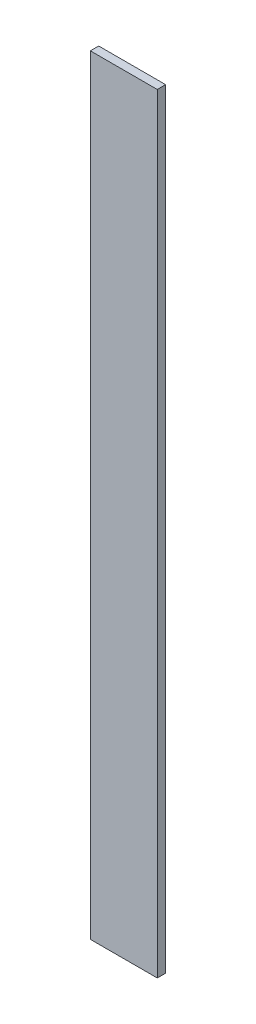
ISO-10303-21;
HEADER;
FILE_DESCRIPTION(('STEP AP214'),'2;1');
FILE_NAME('part.step','',(''),(''),'','','');
FILE_SCHEMA(('AUTOMOTIVE_DESIGN { 1 0 10303 214 1 1 1 1 }'));
ENDSEC;
DATA;
#1=APPLICATION_CONTEXT('core data for automotive mechanical design processes');
#2=APPLICATION_PROTOCOL_DEFINITION('international standard','automotive_design',2000,#1);
#3=PRODUCT_CONTEXT('',#1,'mechanical');
#4=PRODUCT('Part','Part','',(#3));
#5=PRODUCT_RELATED_PRODUCT_CATEGORY('part','',(#4));
#6=PRODUCT_DEFINITION_FORMATION('','',#4);
#7=PRODUCT_DEFINITION_CONTEXT('part definition',#1,'design');
#8=PRODUCT_DEFINITION('design','',#6,#7);
#9=PRODUCT_DEFINITION_SHAPE('','',#8);
#10=(LENGTH_UNIT() NAMED_UNIT(*) SI_UNIT(.MILLI.,.METRE.));
#11=(NAMED_UNIT(*) PLANE_ANGLE_UNIT() SI_UNIT($,.RADIAN.));
#12=(NAMED_UNIT(*) SI_UNIT($,.STERADIAN.) SOLID_ANGLE_UNIT());
#13=UNCERTAINTY_MEASURE_WITH_UNIT(LENGTH_MEASURE(1.E-05),#10,'distance_accuracy_value','');
#14=(GEOMETRIC_REPRESENTATION_CONTEXT(3) GLOBAL_UNCERTAINTY_ASSIGNED_CONTEXT((#13)) GLOBAL_UNIT_ASSIGNED_CONTEXT((#10,
#11,#12)) REPRESENTATION_CONTEXT('',''));
#15=CARTESIAN_POINT('',(0.,0.,0.));
#16=DIRECTION('',(0.,0.,1.));
#17=DIRECTION('',(1.,0.,0.));
#18=AXIS2_PLACEMENT_3D('',#15,#16,#17);
#19=CARTESIAN_POINT('',(25.4,292.1,6.35));
#20=DIRECTION('',(-1.,0.,0.));
#21=DIRECTION('',(0.,-1.,0.));
#22=AXIS2_PLACEMENT_3D('',#19,#20,#21);
#23=PLANE('',#22);
#24=DIRECTION('',(0.,1.,0.));
#25=VECTOR('',#24,1.);
#26=CARTESIAN_POINT('',(25.4,292.1,0.));
#27=LINE('',#26,#25);
#28=CARTESIAN_POINT('',(25.4,-292.1,0.));
#29=VERTEX_POINT('',#28);
#30=CARTESIAN_POINT('',(25.4,292.1,0.));
#31=VERTEX_POINT('',#30);
#32=EDGE_CURVE('E100',#29,#31,#27,.T.);
#33=ORIENTED_EDGE('',*,*,#32,.T.);
#34=DIRECTION('',(0.,0.,-1.));
#35=VECTOR('',#34,1.);
#36=CARTESIAN_POINT('',(25.4,292.1,6.35));
#37=LINE('',#36,#35);
#38=CARTESIAN_POINT('',(25.4,292.1,6.35));
#39=VERTEX_POINT('',#38);
#40=EDGE_CURVE('E11',#39,#31,#37,.T.);
#41=ORIENTED_EDGE('',*,*,#40,.F.);
#42=DIRECTION('',(0.,1.,0.));
#43=VECTOR('',#42,1.);
#44=CARTESIAN_POINT('',(25.4,292.1,6.35));
#45=LINE('',#44,#43);
#46=CARTESIAN_POINT('',(25.4,-292.1,6.35));
#47=VERTEX_POINT('',#46);
#48=EDGE_CURVE('E88',#47,#39,#45,.T.);
#49=ORIENTED_EDGE('',*,*,#48,.F.);
#50=DIRECTION('',(0.,0.,-1.));
#51=VECTOR('',#50,1.);
#52=CARTESIAN_POINT('',(25.4,-292.1,6.35));
#53=LINE('',#52,#51);
#54=EDGE_CURVE('E96',#47,#29,#53,.T.);
#55=ORIENTED_EDGE('',*,*,#54,.T.);
#56=EDGE_LOOP('',(#33,#41,#49,#55));
#57=FACE_BOUND('',#56,.T.);
#58=ADVANCED_FACE('F37',(#57),#23,.F.);
#59=CARTESIAN_POINT('',(-25.4,292.1,6.35));
#60=DIRECTION('',(0.,-1.,0.));
#61=DIRECTION('',(0.,0.,-1.));
#62=AXIS2_PLACEMENT_3D('',#59,#60,#61);
#63=PLANE('',#62);
#64=DIRECTION('',(-1.,0.,0.));
#65=VECTOR('',#64,1.);
#66=CARTESIAN_POINT('',(-25.4,292.1,0.));
#67=LINE('',#66,#65);
#68=CARTESIAN_POINT('',(-25.4,292.1,0.));
#69=VERTEX_POINT('',#68);
#70=EDGE_CURVE('E92',#31,#69,#67,.T.);
#71=ORIENTED_EDGE('',*,*,#70,.T.);
#72=DIRECTION('',(0.,0.,-1.));
#73=VECTOR('',#72,1.);
#74=CARTESIAN_POINT('',(-25.4,292.1,6.35));
#75=LINE('',#74,#73);
#76=CARTESIAN_POINT('',(-25.4,292.1,6.35));
#77=VERTEX_POINT('',#76);
#78=EDGE_CURVE('E45',#77,#69,#75,.T.);
#79=ORIENTED_EDGE('',*,*,#78,.F.);
#80=DIRECTION('',(-1.,0.,0.));
#81=VECTOR('',#80,1.);
#82=CARTESIAN_POINT('',(-25.4,292.1,6.35));
#83=LINE('',#82,#81);
#84=EDGE_CURVE('E83',#39,#77,#83,.T.);
#85=ORIENTED_EDGE('',*,*,#84,.F.);
#86=ORIENTED_EDGE('',*,*,#40,.T.);
#87=EDGE_LOOP('',(#71,#79,#85,#86));
#88=FACE_BOUND('',#87,.T.);
#89=ADVANCED_FACE('F91',(#88),#63,.F.);
#90=CARTESIAN_POINT('',(-25.4,292.1,6.35));
#91=DIRECTION('',(1.,0.,0.));
#92=DIRECTION('',(0.,1.,0.));
#93=AXIS2_PLACEMENT_3D('',#90,#91,#92);
#94=PLANE('',#93);
#95=DIRECTION('',(0.,-1.,0.));
#96=VECTOR('',#95,1.);
#97=CARTESIAN_POINT('',(-25.4,292.1,0.));
#98=LINE('',#97,#96);
#99=CARTESIAN_POINT('',(-25.4,-292.1,0.));
#100=VERTEX_POINT('',#99);
#101=EDGE_CURVE('E70',#69,#100,#98,.T.);
#102=ORIENTED_EDGE('',*,*,#101,.T.);
#103=DIRECTION('',(0.,0.,-1.));
#104=VECTOR('',#103,1.);
#105=CARTESIAN_POINT('',(-25.4,-292.1,6.35));
#106=LINE('',#105,#104);
#107=CARTESIAN_POINT('',(-25.4,-292.1,6.35));
#108=VERTEX_POINT('',#107);
#109=EDGE_CURVE('E93',#108,#100,#106,.T.);
#110=ORIENTED_EDGE('',*,*,#109,.F.);
#111=DIRECTION('',(0.,-1.,0.));
#112=VECTOR('',#111,1.);
#113=CARTESIAN_POINT('',(-25.4,292.1,6.35));
#114=LINE('',#113,#112);
#115=EDGE_CURVE('E86',#77,#108,#114,.T.);
#116=ORIENTED_EDGE('',*,*,#115,.F.);
#117=ORIENTED_EDGE('',*,*,#78,.T.);
#118=EDGE_LOOP('',(#102,#110,#116,#117));
#119=FACE_BOUND('',#118,.T.);
#120=ADVANCED_FACE('F94',(#119),#94,.F.);
#121=CARTESIAN_POINT('',(-25.4,-292.1,6.35));
#122=DIRECTION('',(0.,1.,0.));
#123=DIRECTION('',(0.,0.,1.));
#124=AXIS2_PLACEMENT_3D('',#121,#122,#123);
#125=PLANE('',#124);
#126=DIRECTION('',(1.,0.,0.));
#127=VECTOR('',#126,1.);
#128=CARTESIAN_POINT('',(-25.4,-292.1,0.));
#129=LINE('',#128,#127);
#130=EDGE_CURVE('E76',#100,#29,#129,.T.);
#131=ORIENTED_EDGE('',*,*,#130,.T.);
#132=ORIENTED_EDGE('',*,*,#54,.F.);
#133=DIRECTION('',(1.,0.,0.));
#134=VECTOR('',#133,1.);
#135=CARTESIAN_POINT('',(-25.4,-292.1,6.35));
#136=LINE('',#135,#134);
#137=EDGE_CURVE('E53',#108,#47,#136,.T.);
#138=ORIENTED_EDGE('',*,*,#137,.F.);
#139=ORIENTED_EDGE('',*,*,#109,.T.);
#140=EDGE_LOOP('',(#131,#132,#138,#139));
#141=FACE_BOUND('',#140,.T.);
#142=ADVANCED_FACE('F107',(#141),#125,.F.);
#143=CARTESIAN_POINT('',(0.,0.,6.35));
#144=DIRECTION('',(0.,0.,1.));
#145=DIRECTION('',(1.,0.,0.));
#146=AXIS2_PLACEMENT_3D('',#143,#144,#145);
#147=PLANE('',#146);
#148=ORIENTED_EDGE('',*,*,#48,.T.);
#149=ORIENTED_EDGE('',*,*,#84,.T.);
#150=ORIENTED_EDGE('',*,*,#115,.T.);
#151=ORIENTED_EDGE('',*,*,#137,.T.);
#152=EDGE_LOOP('',(#148,#149,#150,#151));
#153=FACE_BOUND('',#152,.T.);
#154=ADVANCED_FACE('F84',(#153),#147,.T.);
#155=CARTESIAN_POINT('',(0.,0.,0.));
#156=DIRECTION('',(0.,0.,1.));
#157=DIRECTION('',(1.,0.,0.));
#158=AXIS2_PLACEMENT_3D('',#155,#156,#157);
#159=PLANE('',#158);
#160=ORIENTED_EDGE('',*,*,#32,.F.);
#161=ORIENTED_EDGE('',*,*,#130,.F.);
#162=ORIENTED_EDGE('',*,*,#101,.F.);
#163=ORIENTED_EDGE('',*,*,#70,.F.);
#164=EDGE_LOOP('',(#160,#161,#162,#163));
#165=FACE_BOUND('',#164,.T.);
#166=ADVANCED_FACE('F110',(#165),#159,.F.);
#167=CLOSED_SHELL('',(#58,#89,#120,#142,#154,#166));
#168=MANIFOLD_SOLID_BREP('B2',#167);
#169=ADVANCED_BREP_SHAPE_REPRESENTATION('',(#18,#168),#14);
#170=SHAPE_DEFINITION_REPRESENTATION(#9,#169);
ENDSEC;
END-ISO-10303-21;
